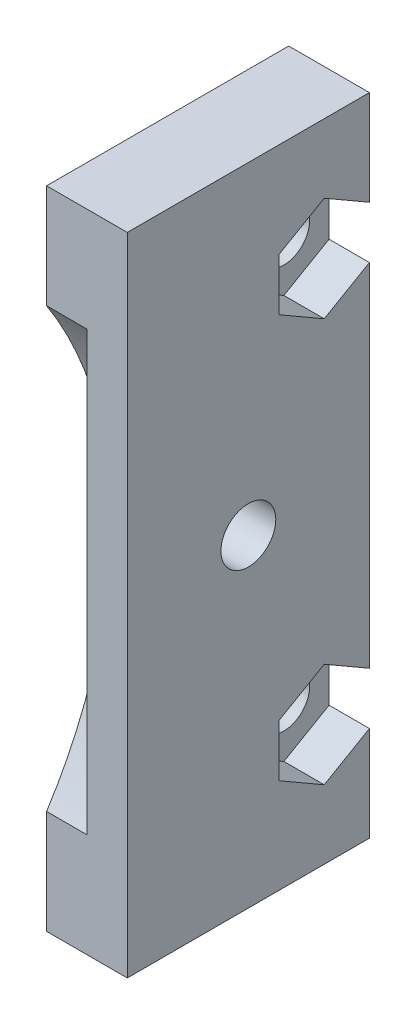
ISO-10303-21;
HEADER;
FILE_DESCRIPTION(('STEP AP214'),'2;1');
FILE_NAME('part.step','',(''),(''),'','','');
FILE_SCHEMA(('AUTOMOTIVE_DESIGN { 1 0 10303 214 1 1 1 1 }'));
ENDSEC;
DATA;
#1=APPLICATION_CONTEXT('core data for automotive mechanical design processes');
#2=APPLICATION_PROTOCOL_DEFINITION('international standard','automotive_design',2000,#1);
#3=PRODUCT_CONTEXT('',#1,'mechanical');
#4=PRODUCT('Part','Part','',(#3));
#5=PRODUCT_RELATED_PRODUCT_CATEGORY('part','',(#4));
#6=PRODUCT_DEFINITION_FORMATION('','',#4);
#7=PRODUCT_DEFINITION_CONTEXT('part definition',#1,'design');
#8=PRODUCT_DEFINITION('design','',#6,#7);
#9=PRODUCT_DEFINITION_SHAPE('','',#8);
#10=(LENGTH_UNIT() NAMED_UNIT(*) SI_UNIT(.MILLI.,.METRE.));
#11=(NAMED_UNIT(*) PLANE_ANGLE_UNIT() SI_UNIT($,.RADIAN.));
#12=(NAMED_UNIT(*) SI_UNIT($,.STERADIAN.) SOLID_ANGLE_UNIT());
#13=UNCERTAINTY_MEASURE_WITH_UNIT(LENGTH_MEASURE(1.E-05),#10,'distance_accuracy_value','');
#14=(GEOMETRIC_REPRESENTATION_CONTEXT(3) GLOBAL_UNCERTAINTY_ASSIGNED_CONTEXT((#13)) GLOBAL_UNIT_ASSIGNED_CONTEXT((#10,
#11,#12)) REPRESENTATION_CONTEXT('',''));
#15=CARTESIAN_POINT('',(0.,0.,0.));
#16=DIRECTION('',(0.,0.,1.));
#17=DIRECTION('',(1.,0.,0.));
#18=AXIS2_PLACEMENT_3D('',#15,#16,#17);
#19=CARTESIAN_POINT('',(2.5,0.,0.));
#20=DIRECTION('',(0.,1.,0.));
#21=DIRECTION('',(0.,0.,1.));
#22=AXIS2_PLACEMENT_3D('',#19,#20,#21);
#23=PLANE('',#22);
#24=DIRECTION('',(-1.,0.,0.));
#25=VECTOR('',#24,1.);
#26=CARTESIAN_POINT('',(2.5,0.,0.));
#27=LINE('',#26,#25);
#28=CARTESIAN_POINT('',(2.5,0.,0.));
#29=VERTEX_POINT('',#28);
#30=CARTESIAN_POINT('',(-2.5,0.,0.));
#31=VERTEX_POINT('',#30);
#32=EDGE_CURVE('E322',#29,#31,#27,.T.);
#33=ORIENTED_EDGE('',*,*,#32,.T.);
#34=DIRECTION('',(0.,0.,-1.));
#35=VECTOR('',#34,1.);
#36=CARTESIAN_POINT('',(-2.5,0.,0.));
#37=LINE('',#36,#35);
#38=CARTESIAN_POINT('',(-2.5,0.,-15.));
#39=VERTEX_POINT('',#38);
#40=EDGE_CURVE('E253',#31,#39,#37,.T.);
#41=ORIENTED_EDGE('',*,*,#40,.T.);
#42=DIRECTION('',(-1.,0.,0.));
#43=VECTOR('',#42,1.);
#44=CARTESIAN_POINT('',(2.5,0.,-15.));
#45=LINE('',#44,#43);
#46=CARTESIAN_POINT('',(2.5,0.,-15.));
#47=VERTEX_POINT('',#46);
#48=EDGE_CURVE('E12',#47,#39,#45,.T.);
#49=ORIENTED_EDGE('',*,*,#48,.F.);
#50=DIRECTION('',(0.,0.,-1.));
#51=VECTOR('',#50,1.);
#52=CARTESIAN_POINT('',(2.5,0.,0.));
#53=LINE('',#52,#51);
#54=EDGE_CURVE('E278',#29,#47,#53,.T.);
#55=ORIENTED_EDGE('',*,*,#54,.F.);
#56=EDGE_LOOP('',(#33,#41,#49,#55));
#57=FACE_BOUND('',#56,.T.);
#58=ADVANCED_FACE('F51',(#57),#23,.F.);
#59=CARTESIAN_POINT('',(2.5,-2.08262609368152,-1.20240473580836));
#60=DIRECTION('',(0.,0.866025403784439,0.5));
#61=DIRECTION('',(0.,-0.5,0.866025403784439));
#62=AXIS2_PLACEMENT_3D('',#59,#60,#61);
#63=PLANE('',#62);
#64=DIRECTION('',(0.,0.5,-0.866025403784439));
#65=VECTOR('',#64,1.);
#66=CARTESIAN_POINT('',(0.,-2.08262609368152,-1.20240473580836));
#67=LINE('',#66,#65);
#68=CARTESIAN_POINT('',(0.,4.26683849253807,-12.2));
#69=VERTEX_POINT('',#68);
#70=CARTESIAN_POINT('',(0.,5.88341924626902,-15.));
#71=VERTEX_POINT('',#70);
#72=EDGE_CURVE('E265',#69,#71,#67,.T.);
#73=ORIENTED_EDGE('',*,*,#72,.F.);
#74=DIRECTION('',(-1.,0.,0.));
#75=VECTOR('',#74,1.);
#76=CARTESIAN_POINT('',(2.5,4.26683849253807,-12.2));
#77=LINE('',#76,#75);
#78=CARTESIAN_POINT('',(2.5,4.26683849253807,-12.2));
#79=VERTEX_POINT('',#78);
#80=EDGE_CURVE('E378',#79,#69,#77,.T.);
#81=ORIENTED_EDGE('',*,*,#80,.F.);
#82=DIRECTION('',(0.,0.5,-0.866025403784439));
#83=VECTOR('',#82,1.);
#84=CARTESIAN_POINT('',(2.5,-2.08262609368152,-1.20240473580836));
#85=LINE('',#84,#83);
#86=CARTESIAN_POINT('',(2.5,5.88341924626902,-15.));
#87=VERTEX_POINT('',#86);
#88=EDGE_CURVE('E284',#79,#87,#85,.T.);
#89=ORIENTED_EDGE('',*,*,#88,.T.);
#90=DIRECTION('',(-1.,0.,0.));
#91=VECTOR('',#90,1.);
#92=CARTESIAN_POINT('',(2.5,5.88341924626902,-15.));
#93=LINE('',#92,#91);
#94=EDGE_CURVE('E59',#87,#71,#93,.T.);
#95=ORIENTED_EDGE('',*,*,#94,.T.);
#96=EDGE_LOOP('',(#73,#81,#89,#95));
#97=FACE_BOUND('',#96,.T.);
#98=ADVANCED_FACE('F382',(#97),#63,.T.);
#99=CARTESIAN_POINT('',(2.5,8.48288383248863,-4.89759526419164));
#100=DIRECTION('',(0.,0.866025403784438,-0.5));
#101=DIRECTION('',(0.,0.5,0.866025403784438));
#102=AXIS2_PLACEMENT_3D('',#99,#100,#101);
#103=PLANE('',#102);
#104=DIRECTION('',(0.,-0.5,-0.866025403784438));
#105=VECTOR('',#104,1.);
#106=CARTESIAN_POINT('',(0.,8.48288383248863,-4.89759526419164));
#107=LINE('',#106,#105);
#108=CARTESIAN_POINT('',(0.,5.88341924626904,-9.39999999999997));
#109=VERTEX_POINT('',#108);
#110=EDGE_CURVE('E325',#109,#69,#107,.T.);
#111=ORIENTED_EDGE('',*,*,#110,.F.);
#112=DIRECTION('',(-1.,0.,0.));
#113=VECTOR('',#112,1.);
#114=CARTESIAN_POINT('',(2.5,5.88341924626904,-9.39999999999997));
#115=LINE('',#114,#113);
#116=CARTESIAN_POINT('',(2.5,5.88341924626904,-9.39999999999997));
#117=VERTEX_POINT('',#116);
#118=EDGE_CURVE('E376',#117,#109,#115,.T.);
#119=ORIENTED_EDGE('',*,*,#118,.F.);
#120=DIRECTION('',(0.,-0.5,-0.866025403784438));
#121=VECTOR('',#120,1.);
#122=CARTESIAN_POINT('',(2.5,8.48288383248863,-4.89759526419164));
#123=LINE('',#122,#121);
#124=EDGE_CURVE('E289',#117,#79,#123,.T.);
#125=ORIENTED_EDGE('',*,*,#124,.T.);
#126=ORIENTED_EDGE('',*,*,#80,.T.);
#127=EDGE_LOOP('',(#111,#119,#125,#126));
#128=FACE_BOUND('',#127,.T.);
#129=ADVANCED_FACE('F406',(#128),#103,.T.);
#130=CARTESIAN_POINT('',(2.5,0.,-9.39999999999997));
#131=DIRECTION('',(0.,0.,-1.));
#132=DIRECTION('',(-1.,0.,0.));
#133=AXIS2_PLACEMENT_3D('',#130,#131,#132);
#134=PLANE('',#133);
#135=DIRECTION('',(0.,-1.,0.));
#136=VECTOR('',#135,1.);
#137=CARTESIAN_POINT('',(0.,0.,-9.39999999999997));
#138=LINE('',#137,#136);
#139=CARTESIAN_POINT('',(0.,9.11658075373097,-9.39999999999998));
#140=VERTEX_POINT('',#139);
#141=EDGE_CURVE('E328',#140,#109,#138,.T.);
#142=ORIENTED_EDGE('',*,*,#141,.F.);
#143=DIRECTION('',(-1.,0.,0.));
#144=VECTOR('',#143,1.);
#145=CARTESIAN_POINT('',(2.5,9.11658075373097,-9.39999999999998));
#146=LINE('',#145,#144);
#147=CARTESIAN_POINT('',(2.5,9.11658075373097,-9.39999999999998));
#148=VERTEX_POINT('',#147);
#149=EDGE_CURVE('E374',#148,#140,#146,.T.);
#150=ORIENTED_EDGE('',*,*,#149,.F.);
#151=DIRECTION('',(0.,-1.,0.));
#152=VECTOR('',#151,1.);
#153=CARTESIAN_POINT('',(2.5,0.,-9.39999999999997));
#154=LINE('',#153,#152);
#155=EDGE_CURVE('E292',#148,#117,#154,.T.);
#156=ORIENTED_EDGE('',*,*,#155,.T.);
#157=ORIENTED_EDGE('',*,*,#118,.T.);
#158=EDGE_LOOP('',(#142,#150,#156,#157));
#159=FACE_BOUND('',#158,.T.);
#160=ADVANCED_FACE('F403',(#159),#134,.T.);
#161=CARTESIAN_POINT('',(2.5,2.76711616751138,1.59759526419166));
#162=DIRECTION('',(0.,-0.866025403784439,-0.5));
#163=DIRECTION('',(0.,0.5,-0.866025403784439));
#164=AXIS2_PLACEMENT_3D('',#161,#162,#163);
#165=PLANE('',#164);
#166=DIRECTION('',(0.,-0.5,0.866025403784439));
#167=VECTOR('',#166,1.);
#168=CARTESIAN_POINT('',(0.,2.76711616751138,1.59759526419166));
#169=LINE('',#168,#167);
#170=CARTESIAN_POINT('',(0.,10.7331615074619,-12.2));
#171=VERTEX_POINT('',#170);
#172=EDGE_CURVE('E331',#171,#140,#169,.T.);
#173=ORIENTED_EDGE('',*,*,#172,.F.);
#174=DIRECTION('',(-1.,0.,0.));
#175=VECTOR('',#174,1.);
#176=CARTESIAN_POINT('',(2.5,10.7331615074619,-12.2));
#177=LINE('',#176,#175);
#178=CARTESIAN_POINT('',(2.5,10.7331615074619,-12.2));
#179=VERTEX_POINT('',#178);
#180=EDGE_CURVE('E372',#179,#171,#177,.T.);
#181=ORIENTED_EDGE('',*,*,#180,.F.);
#182=DIRECTION('',(0.,-0.5,0.866025403784439));
#183=VECTOR('',#182,1.);
#184=CARTESIAN_POINT('',(2.5,2.76711616751138,1.59759526419166));
#185=LINE('',#184,#183);
#186=EDGE_CURVE('E295',#179,#148,#185,.T.);
#187=ORIENTED_EDGE('',*,*,#186,.T.);
#188=ORIENTED_EDGE('',*,*,#149,.T.);
#189=EDGE_LOOP('',(#173,#181,#187,#188));
#190=FACE_BOUND('',#189,.T.);
#191=ADVANCED_FACE('F399',(#190),#165,.T.);
#192=CARTESIAN_POINT('',(2.5,13.3326260936815,-7.69759526419166));
#193=DIRECTION('',(0.,-0.866025403784439,0.5));
#194=DIRECTION('',(0.,-0.5,-0.866025403784439));
#195=AXIS2_PLACEMENT_3D('',#192,#193,#194);
#196=PLANE('',#195);
#197=DIRECTION('',(0.,0.5,0.866025403784439));
#198=VECTOR('',#197,1.);
#199=CARTESIAN_POINT('',(0.,13.3326260936815,-7.69759526419166));
#200=LINE('',#199,#198);
#201=CARTESIAN_POINT('',(0.,9.11658075373096,-15.));
#202=VERTEX_POINT('',#201);
#203=EDGE_CURVE('E334',#202,#171,#200,.T.);
#204=ORIENTED_EDGE('',*,*,#203,.F.);
#205=DIRECTION('',(-1.,0.,0.));
#206=VECTOR('',#205,1.);
#207=CARTESIAN_POINT('',(2.5,9.11658075373096,-15.));
#208=LINE('',#207,#206);
#209=CARTESIAN_POINT('',(2.5,9.11658075373096,-15.));
#210=VERTEX_POINT('',#209);
#211=EDGE_CURVE('E370',#210,#202,#208,.T.);
#212=ORIENTED_EDGE('',*,*,#211,.F.);
#213=DIRECTION('',(0.,0.5,0.866025403784439));
#214=VECTOR('',#213,1.);
#215=CARTESIAN_POINT('',(2.5,13.3326260936815,-7.69759526419166));
#216=LINE('',#215,#214);
#217=EDGE_CURVE('E298',#210,#179,#216,.T.);
#218=ORIENTED_EDGE('',*,*,#217,.T.);
#219=ORIENTED_EDGE('',*,*,#180,.T.);
#220=EDGE_LOOP('',(#204,#212,#218,#219));
#221=FACE_BOUND('',#220,.T.);
#222=ADVANCED_FACE('F395',(#221),#196,.T.);
#223=CARTESIAN_POINT('',(2.5,16.6673739063185,9.62291281149714));
#224=DIRECTION('',(0.,0.866025403784438,0.500000000000001));
#225=DIRECTION('',(0.,-0.500000000000001,0.866025403784438));
#226=AXIS2_PLACEMENT_3D('',#223,#224,#225);
#227=PLANE('',#226);
#228=DIRECTION('',(0.,0.500000000000001,-0.866025403784438));
#229=VECTOR('',#228,1.);
#230=CARTESIAN_POINT('',(0.,16.6673739063185,9.62291281149714));
#231=LINE('',#230,#229);
#232=CARTESIAN_POINT('',(0.,29.2668384925381,-12.2));
#233=VERTEX_POINT('',#232);
#234=CARTESIAN_POINT('',(0.,30.8834192462691,-15.));
#235=VERTEX_POINT('',#234);
#236=EDGE_CURVE('E337',#233,#235,#231,.T.);
#237=ORIENTED_EDGE('',*,*,#236,.F.);
#238=DIRECTION('',(-1.,0.,0.));
#239=VECTOR('',#238,1.);
#240=CARTESIAN_POINT('',(2.5,29.2668384925381,-12.2));
#241=LINE('',#240,#239);
#242=CARTESIAN_POINT('',(2.5,29.2668384925381,-12.2));
#243=VERTEX_POINT('',#242);
#244=EDGE_CURVE('E366',#243,#233,#241,.T.);
#245=ORIENTED_EDGE('',*,*,#244,.F.);
#246=DIRECTION('',(0.,0.500000000000001,-0.866025403784438));
#247=VECTOR('',#246,1.);
#248=CARTESIAN_POINT('',(2.5,16.6673739063185,9.62291281149714));
#249=LINE('',#248,#247);
#250=CARTESIAN_POINT('',(2.5,30.8834192462691,-15.));
#251=VERTEX_POINT('',#250);
#252=EDGE_CURVE('E301',#243,#251,#249,.T.);
#253=ORIENTED_EDGE('',*,*,#252,.T.);
#254=DIRECTION('',(-1.,0.,0.));
#255=VECTOR('',#254,1.);
#256=CARTESIAN_POINT('',(2.5,30.8834192462691,-15.));
#257=LINE('',#256,#255);
#258=EDGE_CURVE('E368',#251,#235,#257,.T.);
#259=ORIENTED_EDGE('',*,*,#258,.T.);
#260=EDGE_LOOP('',(#237,#245,#253,#259));
#261=FACE_BOUND('',#260,.T.);
#262=ADVANCED_FACE('F459',(#261),#227,.T.);
#263=CARTESIAN_POINT('',(2.5,27.2328838324886,-15.7229128114972));
#264=DIRECTION('',(0.,0.866025403784438,-0.500000000000001));
#265=DIRECTION('',(0.,0.500000000000001,0.866025403784438));
#266=AXIS2_PLACEMENT_3D('',#263,#264,#265);
#267=PLANE('',#266);
#268=DIRECTION('',(0.,-0.500000000000001,-0.866025403784438));
#269=VECTOR('',#268,1.);
#270=CARTESIAN_POINT('',(0.,27.2328838324886,-15.7229128114972));
#271=LINE('',#270,#269);
#272=CARTESIAN_POINT('',(0.,30.8834192462691,-9.40000000000002));
#273=VERTEX_POINT('',#272);
#274=EDGE_CURVE('E340',#273,#233,#271,.T.);
#275=ORIENTED_EDGE('',*,*,#274,.F.);
#276=DIRECTION('',(-1.,0.,0.));
#277=VECTOR('',#276,1.);
#278=CARTESIAN_POINT('',(2.5,30.8834192462691,-9.40000000000002));
#279=LINE('',#278,#277);
#280=CARTESIAN_POINT('',(2.5,30.8834192462691,-9.40000000000002));
#281=VERTEX_POINT('',#280);
#282=EDGE_CURVE('E364',#281,#273,#279,.T.);
#283=ORIENTED_EDGE('',*,*,#282,.F.);
#284=DIRECTION('',(0.,-0.500000000000001,-0.866025403784438));
#285=VECTOR('',#284,1.);
#286=CARTESIAN_POINT('',(2.5,27.2328838324886,-15.7229128114972));
#287=LINE('',#286,#285);
#288=EDGE_CURVE('E304',#281,#243,#287,.T.);
#289=ORIENTED_EDGE('',*,*,#288,.T.);
#290=ORIENTED_EDGE('',*,*,#244,.T.);
#291=EDGE_LOOP('',(#275,#283,#289,#290));
#292=FACE_BOUND('',#291,.T.);
#293=ADVANCED_FACE('F462',(#292),#267,.T.);
#294=CARTESIAN_POINT('',(2.5,0.,-9.40000000000002));
#295=DIRECTION('',(0.,0.,-1.));
#296=DIRECTION('',(-1.,0.,0.));
#297=AXIS2_PLACEMENT_3D('',#294,#295,#296);
#298=PLANE('',#297);
#299=DIRECTION('',(0.,-1.,0.));
#300=VECTOR('',#299,1.);
#301=CARTESIAN_POINT('',(0.,0.,-9.40000000000002));
#302=LINE('',#301,#300);
#303=CARTESIAN_POINT('',(0.,34.1165807537309,-9.40000000000002));
#304=VERTEX_POINT('',#303);
#305=EDGE_CURVE('E343',#304,#273,#302,.T.);
#306=ORIENTED_EDGE('',*,*,#305,.F.);
#307=DIRECTION('',(-1.,0.,0.));
#308=VECTOR('',#307,1.);
#309=CARTESIAN_POINT('',(2.5,34.1165807537309,-9.40000000000002));
#310=LINE('',#309,#308);
#311=CARTESIAN_POINT('',(2.5,34.1165807537309,-9.40000000000002));
#312=VERTEX_POINT('',#311);
#313=EDGE_CURVE('E362',#312,#304,#310,.T.);
#314=ORIENTED_EDGE('',*,*,#313,.F.);
#315=DIRECTION('',(0.,-1.,0.));
#316=VECTOR('',#315,1.);
#317=CARTESIAN_POINT('',(2.5,0.,-9.40000000000002));
#318=LINE('',#317,#316);
#319=EDGE_CURVE('E307',#312,#281,#318,.T.);
#320=ORIENTED_EDGE('',*,*,#319,.T.);
#321=ORIENTED_EDGE('',*,*,#282,.T.);
#322=EDGE_LOOP('',(#306,#314,#320,#321));
#323=FACE_BOUND('',#322,.T.);
#324=ADVANCED_FACE('F466',(#323),#298,.T.);
#325=CARTESIAN_POINT('',(2.5,21.5171161675113,12.4229128114971));
#326=DIRECTION('',(0.,-0.866025403784438,-0.500000000000002));
#327=DIRECTION('',(0.,0.500000000000002,-0.866025403784438));
#328=AXIS2_PLACEMENT_3D('',#325,#326,#327);
#329=PLANE('',#328);
#330=DIRECTION('',(0.,-0.500000000000002,0.866025403784438));
#331=VECTOR('',#330,1.);
#332=CARTESIAN_POINT('',(0.,21.5171161675113,12.4229128114971));
#333=LINE('',#332,#331);
#334=CARTESIAN_POINT('',(0.,35.7331615074619,-12.2));
#335=VERTEX_POINT('',#334);
#336=EDGE_CURVE('E346',#335,#304,#333,.T.);
#337=ORIENTED_EDGE('',*,*,#336,.F.);
#338=DIRECTION('',(-1.,0.,0.));
#339=VECTOR('',#338,1.);
#340=CARTESIAN_POINT('',(2.5,35.7331615074619,-12.2));
#341=LINE('',#340,#339);
#342=CARTESIAN_POINT('',(2.5,35.7331615074619,-12.2));
#343=VERTEX_POINT('',#342);
#344=EDGE_CURVE('E360',#343,#335,#341,.T.);
#345=ORIENTED_EDGE('',*,*,#344,.F.);
#346=DIRECTION('',(0.,-0.500000000000002,0.866025403784438));
#347=VECTOR('',#346,1.);
#348=CARTESIAN_POINT('',(2.5,21.5171161675113,12.4229128114971));
#349=LINE('',#348,#347);
#350=EDGE_CURVE('E310',#343,#312,#349,.T.);
#351=ORIENTED_EDGE('',*,*,#350,.T.);
#352=ORIENTED_EDGE('',*,*,#313,.T.);
#353=EDGE_LOOP('',(#337,#345,#351,#352));
#354=FACE_BOUND('',#353,.T.);
#355=ADVANCED_FACE('F470',(#354),#329,.T.);
#356=CARTESIAN_POINT('',(2.5,32.0826260936814,-18.5229128114972));
#357=DIRECTION('',(0.,-0.866025403784437,0.500000000000003));
#358=DIRECTION('',(0.,-0.500000000000003,-0.866025403784437));
#359=AXIS2_PLACEMENT_3D('',#356,#357,#358);
#360=PLANE('',#359);
#361=DIRECTION('',(0.,0.500000000000003,0.866025403784437));
#362=VECTOR('',#361,1.);
#363=CARTESIAN_POINT('',(0.,32.0826260936814,-18.5229128114972));
#364=LINE('',#363,#362);
#365=CARTESIAN_POINT('',(0.,34.116580753731,-15.));
#366=VERTEX_POINT('',#365);
#367=EDGE_CURVE('E279',#366,#335,#364,.T.);
#368=ORIENTED_EDGE('',*,*,#367,.F.);
#369=DIRECTION('',(-1.,0.,0.));
#370=VECTOR('',#369,1.);
#371=CARTESIAN_POINT('',(2.5,34.116580753731,-15.));
#372=LINE('',#371,#370);
#373=CARTESIAN_POINT('',(2.5,34.116580753731,-15.));
#374=VERTEX_POINT('',#373);
#375=EDGE_CURVE('E358',#374,#366,#372,.T.);
#376=ORIENTED_EDGE('',*,*,#375,.F.);
#377=DIRECTION('',(0.,0.500000000000003,0.866025403784437));
#378=VECTOR('',#377,1.);
#379=CARTESIAN_POINT('',(2.5,32.0826260936814,-18.5229128114972));
#380=LINE('',#379,#378);
#381=EDGE_CURVE('E313',#374,#343,#380,.T.);
#382=ORIENTED_EDGE('',*,*,#381,.T.);
#383=ORIENTED_EDGE('',*,*,#344,.T.);
#384=EDGE_LOOP('',(#368,#376,#382,#383));
#385=FACE_BOUND('',#384,.T.);
#386=ADVANCED_FACE('F474',(#385),#360,.T.);
#387=CARTESIAN_POINT('',(2.5,0.,-15.));
#388=DIRECTION('',(0.,0.,1.));
#389=DIRECTION('',(1.,0.,0.));
#390=AXIS2_PLACEMENT_3D('',#387,#388,#389);
#391=PLANE('',#390);
#392=ORIENTED_EDGE('',*,*,#375,.T.);
#393=DIRECTION('',(0.,1.,0.));
#394=VECTOR('',#393,1.);
#395=CARTESIAN_POINT('',(0.,0.,-15.));
#396=LINE('',#395,#394);
#397=EDGE_CURVE('E248',#235,#366,#396,.T.);
#398=ORIENTED_EDGE('',*,*,#397,.F.);
#399=ORIENTED_EDGE('',*,*,#258,.F.);
#400=DIRECTION('',(0.,1.,0.));
#401=VECTOR('',#400,1.);
#402=CARTESIAN_POINT('',(2.5,0.,-15.));
#403=LINE('',#402,#401);
#404=EDGE_CURVE('E286',#210,#251,#403,.T.);
#405=ORIENTED_EDGE('',*,*,#404,.F.);
#406=ORIENTED_EDGE('',*,*,#211,.T.);
#407=EDGE_CURVE('E268',#71,#202,#396,.T.);
#408=ORIENTED_EDGE('',*,*,#407,.F.);
#409=ORIENTED_EDGE('',*,*,#94,.F.);
#410=EDGE_CURVE('E282',#47,#87,#403,.T.);
#411=ORIENTED_EDGE('',*,*,#410,.F.);
#412=ORIENTED_EDGE('',*,*,#48,.T.);
#413=DIRECTION('',(0.,1.,0.));
#414=VECTOR('',#413,1.);
#415=CARTESIAN_POINT('',(-2.5,0.,-15.));
#416=LINE('',#415,#414);
#417=CARTESIAN_POINT('',(-2.5,5.23725830020304,-15.));
#418=VERTEX_POINT('',#417);
#419=EDGE_CURVE('E215',#39,#418,#416,.T.);
#420=ORIENTED_EDGE('',*,*,#419,.T.);
#421=DIRECTION('',(1.,0.,0.));
#422=VECTOR('',#421,1.);
#423=CARTESIAN_POINT('',(-3.5,5.23725830020304,-15.));
#424=LINE('',#423,#422);
#425=CARTESIAN_POINT('',(-3.5,5.23725830020304,-15.));
#426=VERTEX_POINT('',#425);
#427=EDGE_CURVE('E205',#426,#418,#424,.T.);
#428=ORIENTED_EDGE('',*,*,#427,.F.);
#429=DIRECTION('',(0.,-1.,0.));
#430=VECTOR('',#429,1.);
#431=CARTESIAN_POINT('',(-3.5,0.,-15.));
#432=LINE('',#431,#430);
#433=CARTESIAN_POINT('',(-3.5,9.76274169979695,-15.));
#434=VERTEX_POINT('',#433);
#435=EDGE_CURVE('E209',#434,#426,#432,.T.);
#436=ORIENTED_EDGE('',*,*,#435,.F.);
#437=DIRECTION('',(1.,0.,0.));
#438=VECTOR('',#437,1.);
#439=CARTESIAN_POINT('',(-3.5,9.76274169979695,-15.));
#440=LINE('',#439,#438);
#441=CARTESIAN_POINT('',(-2.5,9.76274169979695,-15.));
#442=VERTEX_POINT('',#441);
#443=EDGE_CURVE('E206',#434,#442,#440,.T.);
#444=ORIENTED_EDGE('',*,*,#443,.T.);
#445=CARTESIAN_POINT('',(-2.5,30.237258300203,-15.));
#446=VERTEX_POINT('',#445);
#447=EDGE_CURVE('E73',#442,#446,#416,.T.);
#448=ORIENTED_EDGE('',*,*,#447,.T.);
#449=DIRECTION('',(1.,0.,0.));
#450=VECTOR('',#449,1.);
#451=CARTESIAN_POINT('',(-3.5,30.237258300203,-15.));
#452=LINE('',#451,#450);
#453=CARTESIAN_POINT('',(-3.5,30.237258300203,-15.));
#454=VERTEX_POINT('',#453);
#455=EDGE_CURVE('E234',#454,#446,#452,.T.);
#456=ORIENTED_EDGE('',*,*,#455,.F.);
#457=DIRECTION('',(0.,-1.,0.));
#458=VECTOR('',#457,1.);
#459=CARTESIAN_POINT('',(-3.5,0.,-15.));
#460=LINE('',#459,#458);
#461=CARTESIAN_POINT('',(-3.5,34.762741699797,-15.));
#462=VERTEX_POINT('',#461);
#463=EDGE_CURVE('E226',#462,#454,#460,.T.);
#464=ORIENTED_EDGE('',*,*,#463,.F.);
#465=DIRECTION('',(1.,0.,0.));
#466=VECTOR('',#465,1.);
#467=CARTESIAN_POINT('',(-3.5,34.762741699797,-15.));
#468=LINE('',#467,#466);
#469=CARTESIAN_POINT('',(-2.5,34.762741699797,-15.));
#470=VERTEX_POINT('',#469);
#471=EDGE_CURVE('E230',#462,#470,#468,.T.);
#472=ORIENTED_EDGE('',*,*,#471,.T.);
#473=CARTESIAN_POINT('',(-2.5,40.,-15.));
#474=VERTEX_POINT('',#473);
#475=EDGE_CURVE('E257',#470,#474,#416,.T.);
#476=ORIENTED_EDGE('',*,*,#475,.T.);
#477=DIRECTION('',(-1.,0.,0.));
#478=VECTOR('',#477,1.);
#479=CARTESIAN_POINT('',(2.5,40.,-15.));
#480=LINE('',#479,#478);
#481=CARTESIAN_POINT('',(2.5,40.,-15.));
#482=VERTEX_POINT('',#481);
#483=EDGE_CURVE('E355',#482,#474,#480,.T.);
#484=ORIENTED_EDGE('',*,*,#483,.F.);
#485=EDGE_CURVE('E285',#374,#482,#403,.T.);
#486=ORIENTED_EDGE('',*,*,#485,.F.);
#487=EDGE_LOOP('',(#392,#398,#399,#405,#406,#408,#409,#411,#412,#420,#428,#436,#444,#448,#456,
#464,#472,#476,#484,#486));
#488=FACE_BOUND('',#487,.T.);
#489=ADVANCED_FACE('F214',(#488),#391,.F.);
#490=CARTESIAN_POINT('',(2.5,40.,0.));
#491=DIRECTION('',(0.,1.,0.));
#492=DIRECTION('',(0.,0.,1.));
#493=AXIS2_PLACEMENT_3D('',#490,#491,#492);
#494=PLANE('',#493);
#495=ORIENTED_EDGE('',*,*,#483,.T.);
#496=DIRECTION('',(0.,0.,-1.));
#497=VECTOR('',#496,1.);
#498=CARTESIAN_POINT('',(-2.5,40.,0.));
#499=LINE('',#498,#497);
#500=CARTESIAN_POINT('',(-2.5,40.,0.));
#501=VERTEX_POINT('',#500);
#502=EDGE_CURVE('E259',#501,#474,#499,.T.);
#503=ORIENTED_EDGE('',*,*,#502,.F.);
#504=DIRECTION('',(-1.,0.,0.));
#505=VECTOR('',#504,1.);
#506=CARTESIAN_POINT('',(2.5,40.,0.));
#507=LINE('',#506,#505);
#508=CARTESIAN_POINT('',(2.5,40.,0.));
#509=VERTEX_POINT('',#508);
#510=EDGE_CURVE('E352',#509,#501,#507,.T.);
#511=ORIENTED_EDGE('',*,*,#510,.F.);
#512=DIRECTION('',(0.,0.,-1.));
#513=VECTOR('',#512,1.);
#514=CARTESIAN_POINT('',(2.5,40.,0.));
#515=LINE('',#514,#513);
#516=EDGE_CURVE('E316',#509,#482,#515,.T.);
#517=ORIENTED_EDGE('',*,*,#516,.T.);
#518=EDGE_LOOP('',(#495,#503,#511,#517));
#519=FACE_BOUND('',#518,.T.);
#520=ADVANCED_FACE('F427',(#519),#494,.T.);
#521=CARTESIAN_POINT('',(2.5,20.,-7.5));
#522=DIRECTION('',(-1.,0.,0.));
#523=DIRECTION('',(0.,0.,1.));
#524=AXIS2_PLACEMENT_3D('',#521,#522,#523);
#525=CYLINDRICAL_SURFACE('',#524,1.7);
#526=CARTESIAN_POINT('',(2.5,20.,-7.5));
#527=DIRECTION('',(1.,0.,0.));
#528=DIRECTION('',(0.,0.,-1.));
#529=AXIS2_PLACEMENT_3D('',#526,#527,#528);
#530=CIRCLE('',#529,1.7);
#531=CARTESIAN_POINT('',(2.5,20.,-9.2));
#532=VERTEX_POINT('',#531);
#533=EDGE_CURVE('E275',#532,#532,#530,.T.);
#534=ORIENTED_EDGE('',*,*,#533,.T.);
#535=EDGE_LOOP('',(#534));
#536=FACE_BOUND('',#535,.T.);
#537=CARTESIAN_POINT('',(-2.5,20.,-7.5));
#538=DIRECTION('',(1.,0.,0.));
#539=DIRECTION('',(0.,0.,-1.));
#540=AXIS2_PLACEMENT_3D('',#537,#538,#539);
#541=CIRCLE('',#540,1.7);
#542=CARTESIAN_POINT('',(-2.5,20.,-9.2));
#543=VERTEX_POINT('',#542);
#544=EDGE_CURVE('E262',#543,#543,#541,.T.);
#545=ORIENTED_EDGE('',*,*,#544,.F.);
#546=EDGE_LOOP('',(#545));
#547=FACE_BOUND('',#546,.T.);
#548=ADVANCED_FACE('F53',(#536,#547),#525,.F.);
#549=CARTESIAN_POINT('',(2.5,0.,0.));
#550=DIRECTION('',(0.,0.,1.));
#551=DIRECTION('',(1.,0.,0.));
#552=AXIS2_PLACEMENT_3D('',#549,#550,#551);
#553=PLANE('',#552);
#554=DIRECTION('',(-1.,0.,0.));
#555=VECTOR('',#554,1.);
#556=CARTESIAN_POINT('',(0.,33.5646599662505,0.));
#557=LINE('',#556,#555);
#558=CARTESIAN_POINT('',(0.,33.5646599662505,0.));
#559=VERTEX_POINT('',#558);
#560=CARTESIAN_POINT('',(-2.5,33.5646599662505,0.));
#561=VERTEX_POINT('',#560);
#562=EDGE_CURVE('E243',#559,#561,#557,.T.);
#563=ORIENTED_EDGE('',*,*,#562,.F.);
#564=DIRECTION('',(0.,1.,0.));
#565=VECTOR('',#564,1.);
#566=CARTESIAN_POINT('',(0.,0.,0.));
#567=LINE('',#566,#565);
#568=CARTESIAN_POINT('',(0.,6.43534003374946,0.));
#569=VERTEX_POINT('',#568);
#570=EDGE_CURVE('E238',#569,#559,#567,.T.);
#571=ORIENTED_EDGE('',*,*,#570,.F.);
#572=DIRECTION('',(-1.,0.,0.));
#573=VECTOR('',#572,1.);
#574=CARTESIAN_POINT('',(0.,6.43534003374946,0.));
#575=LINE('',#574,#573);
#576=CARTESIAN_POINT('',(-2.5,6.43534003374946,0.));
#577=VERTEX_POINT('',#576);
#578=EDGE_CURVE('E245',#569,#577,#575,.T.);
#579=ORIENTED_EDGE('',*,*,#578,.T.);
#580=DIRECTION('',(0.,1.,0.));
#581=VECTOR('',#580,1.);
#582=CARTESIAN_POINT('',(-2.5,0.,0.));
#583=LINE('',#582,#581);
#584=EDGE_CURVE('E250',#31,#577,#583,.T.);
#585=ORIENTED_EDGE('',*,*,#584,.F.);
#586=ORIENTED_EDGE('',*,*,#32,.F.);
#587=DIRECTION('',(0.,1.,0.));
#588=VECTOR('',#587,1.);
#589=CARTESIAN_POINT('',(2.5,0.,0.));
#590=LINE('',#589,#588);
#591=EDGE_CURVE('E319',#29,#509,#590,.T.);
#592=ORIENTED_EDGE('',*,*,#591,.T.);
#593=ORIENTED_EDGE('',*,*,#510,.T.);
#594=EDGE_CURVE('E254',#561,#501,#583,.T.);
#595=ORIENTED_EDGE('',*,*,#594,.F.);
#596=EDGE_LOOP('',(#563,#571,#579,#585,#586,#592,#593,#595));
#597=FACE_BOUND('',#596,.T.);
#598=ADVANCED_FACE('F419',(#597),#553,.T.);
#599=CARTESIAN_POINT('',(2.5,0.,0.));
#600=DIRECTION('',(1.,0.,0.));
#601=DIRECTION('',(0.,0.,-1.));
#602=AXIS2_PLACEMENT_3D('',#599,#600,#601);
#603=PLANE('',#602);
#604=ORIENTED_EDGE('',*,*,#533,.F.);
#605=EDGE_LOOP('',(#604));
#606=FACE_BOUND('',#605,.T.);
#607=ORIENTED_EDGE('',*,*,#54,.T.);
#608=ORIENTED_EDGE('',*,*,#410,.T.);
#609=ORIENTED_EDGE('',*,*,#88,.F.);
#610=ORIENTED_EDGE('',*,*,#124,.F.);
#611=ORIENTED_EDGE('',*,*,#155,.F.);
#612=ORIENTED_EDGE('',*,*,#186,.F.);
#613=ORIENTED_EDGE('',*,*,#217,.F.);
#614=ORIENTED_EDGE('',*,*,#404,.T.);
#615=ORIENTED_EDGE('',*,*,#252,.F.);
#616=ORIENTED_EDGE('',*,*,#288,.F.);
#617=ORIENTED_EDGE('',*,*,#319,.F.);
#618=ORIENTED_EDGE('',*,*,#350,.F.);
#619=ORIENTED_EDGE('',*,*,#381,.F.);
#620=ORIENTED_EDGE('',*,*,#485,.T.);
#621=ORIENTED_EDGE('',*,*,#516,.F.);
#622=ORIENTED_EDGE('',*,*,#591,.F.);
#623=EDGE_LOOP('',(#607,#608,#609,#610,#611,#612,#613,#614,#615,#616,#617,#618,#619,#620,#621,#622));
#624=FACE_BOUND('',#623,.T.);
#625=ADVANCED_FACE('F408',(#606,#624),#603,.T.);
#626=CARTESIAN_POINT('',(0.,0.,0.));
#627=DIRECTION('',(1.,0.,0.));
#628=DIRECTION('',(0.,0.,-1.));
#629=AXIS2_PLACEMENT_3D('',#626,#627,#628);
#630=PLANE('',#629);
#631=CARTESIAN_POINT('',(0.,32.5,-12.2));
#632=DIRECTION('',(1.,0.,0.));
#633=DIRECTION('',(0.,0.,-1.));
#634=AXIS2_PLACEMENT_3D('',#631,#632,#633);
#635=CIRCLE('',#634,1.6);
#636=CARTESIAN_POINT('',(0.,32.5,-13.8));
#637=VERTEX_POINT('',#636);
#638=EDGE_CURVE('E269',#637,#637,#635,.T.);
#639=ORIENTED_EDGE('',*,*,#638,.F.);
#640=EDGE_LOOP('',(#639));
#641=FACE_BOUND('',#640,.T.);
#642=ORIENTED_EDGE('',*,*,#397,.T.);
#643=ORIENTED_EDGE('',*,*,#367,.T.);
#644=ORIENTED_EDGE('',*,*,#336,.T.);
#645=ORIENTED_EDGE('',*,*,#305,.T.);
#646=ORIENTED_EDGE('',*,*,#274,.T.);
#647=ORIENTED_EDGE('',*,*,#236,.T.);
#648=EDGE_LOOP('',(#642,#643,#644,#645,#646,#647));
#649=FACE_BOUND('',#648,.T.);
#650=ADVANCED_FACE('F487',(#641,#649),#630,.T.);
#651=CARTESIAN_POINT('',(-2.5,32.5,-12.2));
#652=DIRECTION('',(1.,0.,0.));
#653=DIRECTION('',(0.,0.,-1.));
#654=AXIS2_PLACEMENT_3D('',#651,#652,#653);
#655=CYLINDRICAL_SURFACE('',#654,1.6);
#656=ORIENTED_EDGE('',*,*,#638,.T.);
#657=EDGE_LOOP('',(#656));
#658=FACE_BOUND('',#657,.T.);
#659=CARTESIAN_POINT('',(-3.5,32.5,-12.2));
#660=DIRECTION('',(-1.,0.,0.));
#661=DIRECTION('',(0.,0.,1.));
#662=AXIS2_PLACEMENT_3D('',#659,#660,#661);
#663=CIRCLE('',#662,1.6);
#664=CARTESIAN_POINT('',(-3.5,32.5,-10.6));
#665=VERTEX_POINT('',#664);
#666=EDGE_CURVE('E219',#665,#665,#663,.F.);
#667=ORIENTED_EDGE('',*,*,#666,.F.);
#668=EDGE_LOOP('',(#667));
#669=FACE_BOUND('',#668,.T.);
#670=ADVANCED_FACE('F489',(#658,#669),#655,.F.);
#671=CARTESIAN_POINT('',(-2.5,7.5,-12.2));
#672=DIRECTION('',(1.,0.,0.));
#673=DIRECTION('',(0.,0.,-1.));
#674=AXIS2_PLACEMENT_3D('',#671,#672,#673);
#675=CYLINDRICAL_SURFACE('',#674,1.6);
#676=CARTESIAN_POINT('',(0.,7.5,-12.2));
#677=DIRECTION('',(1.,0.,0.));
#678=DIRECTION('',(0.,0.,-1.));
#679=AXIS2_PLACEMENT_3D('',#676,#677,#678);
#680=CIRCLE('',#679,1.6);
#681=CARTESIAN_POINT('',(0.,7.5,-13.8));
#682=VERTEX_POINT('',#681);
#683=EDGE_CURVE('E272',#682,#682,#680,.T.);
#684=ORIENTED_EDGE('',*,*,#683,.T.);
#685=EDGE_LOOP('',(#684));
#686=FACE_BOUND('',#685,.T.);
#687=CARTESIAN_POINT('',(-3.5,7.5,-12.2));
#688=DIRECTION('',(-1.,0.,0.));
#689=DIRECTION('',(0.,0.,1.));
#690=AXIS2_PLACEMENT_3D('',#687,#688,#689);
#691=CIRCLE('',#690,1.6);
#692=CARTESIAN_POINT('',(-3.5,7.5,-10.6));
#693=VERTEX_POINT('',#692);
#694=EDGE_CURVE('E212',#693,#693,#691,.F.);
#695=ORIENTED_EDGE('',*,*,#694,.F.);
#696=EDGE_LOOP('',(#695));
#697=FACE_BOUND('',#696,.T.);
#698=ADVANCED_FACE('F492',(#686,#697),#675,.F.);
#699=CARTESIAN_POINT('',(-2.5,0.,0.));
#700=DIRECTION('',(1.,0.,0.));
#701=DIRECTION('',(0.,0.,-1.));
#702=AXIS2_PLACEMENT_3D('',#699,#700,#701);
#703=PLANE('',#702);
#704=CARTESIAN_POINT('',(-2.5,7.5,-12.2));
#705=DIRECTION('',(-1.,0.,0.));
#706=DIRECTION('',(0.,0.,1.));
#707=AXIS2_PLACEMENT_3D('',#704,#705,#706);
#708=CIRCLE('',#707,3.6);
#709=EDGE_CURVE('E66',#418,#442,#708,.T.);
#710=ORIENTED_EDGE('',*,*,#709,.F.);
#711=ORIENTED_EDGE('',*,*,#419,.F.);
#712=ORIENTED_EDGE('',*,*,#40,.F.);
#713=ORIENTED_EDGE('',*,*,#584,.T.);
#714=CARTESIAN_POINT('',(-2.5,20.,21.));
#715=DIRECTION('',(-1.,0.,0.));
#716=DIRECTION('',(0.,0.,1.));
#717=AXIS2_PLACEMENT_3D('',#714,#715,#716);
#718=CIRCLE('',#717,25.);
#719=EDGE_CURVE('E237',#561,#577,#718,.T.);
#720=ORIENTED_EDGE('',*,*,#719,.F.);
#721=ORIENTED_EDGE('',*,*,#594,.T.);
#722=ORIENTED_EDGE('',*,*,#502,.T.);
#723=ORIENTED_EDGE('',*,*,#475,.F.);
#724=CARTESIAN_POINT('',(-2.5,32.5,-12.2));
#725=DIRECTION('',(-1.,0.,0.));
#726=DIRECTION('',(0.,0.,1.));
#727=AXIS2_PLACEMENT_3D('',#724,#725,#726);
#728=CIRCLE('',#727,3.6);
#729=EDGE_CURVE('E216',#446,#470,#728,.T.);
#730=ORIENTED_EDGE('',*,*,#729,.F.);
#731=ORIENTED_EDGE('',*,*,#447,.F.);
#732=EDGE_LOOP('',(#710,#711,#712,#713,#720,#721,#722,#723,#730,#731));
#733=FACE_BOUND('',#732,.T.);
#734=ORIENTED_EDGE('',*,*,#544,.T.);
#735=EDGE_LOOP('',(#734));
#736=FACE_BOUND('',#735,.T.);
#737=ADVANCED_FACE('F414',(#733,#736),#703,.F.);
#738=ORIENTED_EDGE('',*,*,#407,.T.);
#739=ORIENTED_EDGE('',*,*,#203,.T.);
#740=ORIENTED_EDGE('',*,*,#172,.T.);
#741=ORIENTED_EDGE('',*,*,#141,.T.);
#742=ORIENTED_EDGE('',*,*,#110,.T.);
#743=ORIENTED_EDGE('',*,*,#72,.T.);
#744=EDGE_LOOP('',(#738,#739,#740,#741,#742,#743));
#745=FACE_BOUND('',#744,.T.);
#746=ORIENTED_EDGE('',*,*,#683,.F.);
#747=EDGE_LOOP('',(#746));
#748=FACE_BOUND('',#747,.T.);
#749=ADVANCED_FACE('F387',(#745,#748),#630,.T.);
#750=CARTESIAN_POINT('',(0.,20.,21.));
#751=DIRECTION('',(-1.,0.,0.));
#752=DIRECTION('',(0.,0.,1.));
#753=AXIS2_PLACEMENT_3D('',#750,#751,#752);
#754=CYLINDRICAL_SURFACE('',#753,25.);
#755=ORIENTED_EDGE('',*,*,#719,.T.);
#756=ORIENTED_EDGE('',*,*,#578,.F.);
#757=CARTESIAN_POINT('',(0.,20.,21.));
#758=DIRECTION('',(-1.,0.,0.));
#759=DIRECTION('',(0.,0.,1.));
#760=AXIS2_PLACEMENT_3D('',#757,#758,#759);
#761=CIRCLE('',#760,25.);
#762=EDGE_CURVE('E240',#559,#569,#761,.T.);
#763=ORIENTED_EDGE('',*,*,#762,.F.);
#764=ORIENTED_EDGE('',*,*,#562,.T.);
#765=EDGE_LOOP('',(#755,#756,#763,#764));
#766=FACE_BOUND('',#765,.T.);
#767=ADVANCED_FACE('F499',(#766),#754,.F.);
#768=CARTESIAN_POINT('',(0.,0.,0.));
#769=DIRECTION('',(-1.,0.,0.));
#770=DIRECTION('',(0.,0.,1.));
#771=AXIS2_PLACEMENT_3D('',#768,#769,#770);
#772=PLANE('',#771);
#773=ORIENTED_EDGE('',*,*,#570,.T.);
#774=ORIENTED_EDGE('',*,*,#762,.T.);
#775=EDGE_LOOP('',(#773,#774));
#776=FACE_BOUND('',#775,.T.);
#777=ADVANCED_FACE('F443',(#776),#772,.T.);
#778=CARTESIAN_POINT('',(-3.5,32.5,-12.2));
#779=DIRECTION('',(1.,0.,0.));
#780=DIRECTION('',(0.,0.,-1.));
#781=AXIS2_PLACEMENT_3D('',#778,#779,#780);
#782=CYLINDRICAL_SURFACE('',#781,3.6);
#783=ORIENTED_EDGE('',*,*,#729,.T.);
#784=ORIENTED_EDGE('',*,*,#471,.F.);
#785=CARTESIAN_POINT('',(-3.5,32.5,-12.2));
#786=DIRECTION('',(-1.,0.,0.));
#787=DIRECTION('',(0.,0.,1.));
#788=AXIS2_PLACEMENT_3D('',#785,#786,#787);
#789=CIRCLE('',#788,3.6);
#790=EDGE_CURVE('E229',#454,#462,#789,.T.);
#791=ORIENTED_EDGE('',*,*,#790,.F.);
#792=ORIENTED_EDGE('',*,*,#455,.T.);
#793=EDGE_LOOP('',(#783,#784,#791,#792));
#794=FACE_BOUND('',#793,.T.);
#795=ADVANCED_FACE('F431',(#794),#782,.T.);
#796=CARTESIAN_POINT('',(-3.5,0.,0.));
#797=DIRECTION('',(-1.,0.,0.));
#798=DIRECTION('',(0.,0.,1.));
#799=AXIS2_PLACEMENT_3D('',#796,#797,#798);
#800=PLANE('',#799);
#801=ORIENTED_EDGE('',*,*,#666,.T.);
#802=EDGE_LOOP('',(#801));
#803=FACE_BOUND('',#802,.T.);
#804=ORIENTED_EDGE('',*,*,#463,.T.);
#805=ORIENTED_EDGE('',*,*,#790,.T.);
#806=EDGE_LOOP('',(#804,#805));
#807=FACE_BOUND('',#806,.T.);
#808=ADVANCED_FACE('F434',(#803,#807),#800,.T.);
#809=CARTESIAN_POINT('',(-3.5,7.5,-12.2));
#810=DIRECTION('',(1.,0.,0.));
#811=DIRECTION('',(0.,0.,-1.));
#812=AXIS2_PLACEMENT_3D('',#809,#810,#811);
#813=CYLINDRICAL_SURFACE('',#812,3.6);
#814=ORIENTED_EDGE('',*,*,#709,.T.);
#815=ORIENTED_EDGE('',*,*,#443,.F.);
#816=CARTESIAN_POINT('',(-3.5,7.5,-12.2));
#817=DIRECTION('',(-1.,0.,0.));
#818=DIRECTION('',(0.,0.,1.));
#819=AXIS2_PLACEMENT_3D('',#816,#817,#818);
#820=CIRCLE('',#819,3.6);
#821=EDGE_CURVE('E201',#426,#434,#820,.T.);
#822=ORIENTED_EDGE('',*,*,#821,.F.);
#823=ORIENTED_EDGE('',*,*,#427,.T.);
#824=EDGE_LOOP('',(#814,#815,#822,#823));
#825=FACE_BOUND('',#824,.T.);
#826=ADVANCED_FACE('F203',(#825),#813,.T.);
#827=CARTESIAN_POINT('',(-3.5,0.,0.));
#828=DIRECTION('',(-1.,0.,0.));
#829=DIRECTION('',(0.,0.,1.));
#830=AXIS2_PLACEMENT_3D('',#827,#828,#829);
#831=PLANE('',#830);
#832=ORIENTED_EDGE('',*,*,#694,.T.);
#833=EDGE_LOOP('',(#832));
#834=FACE_BOUND('',#833,.T.);
#835=ORIENTED_EDGE('',*,*,#435,.T.);
#836=ORIENTED_EDGE('',*,*,#821,.T.);
#837=EDGE_LOOP('',(#835,#836));
#838=FACE_BOUND('',#837,.T.);
#839=ADVANCED_FACE('F211',(#834,#838),#831,.T.);
#840=CLOSED_SHELL('',(#58,#98,#129,#160,#191,#222,#262,#293,#324,#355,#386,#489,#520,#548,#598,
#625,#650,#670,#698,#737,#749,#767,#777,#795,#808,#826,#839));
#841=MANIFOLD_SOLID_BREP('B2',#840);
#842=ADVANCED_BREP_SHAPE_REPRESENTATION('',(#18,#841),#14);
#843=SHAPE_DEFINITION_REPRESENTATION(#9,#842);
ENDSEC;
END-ISO-10303-21;
